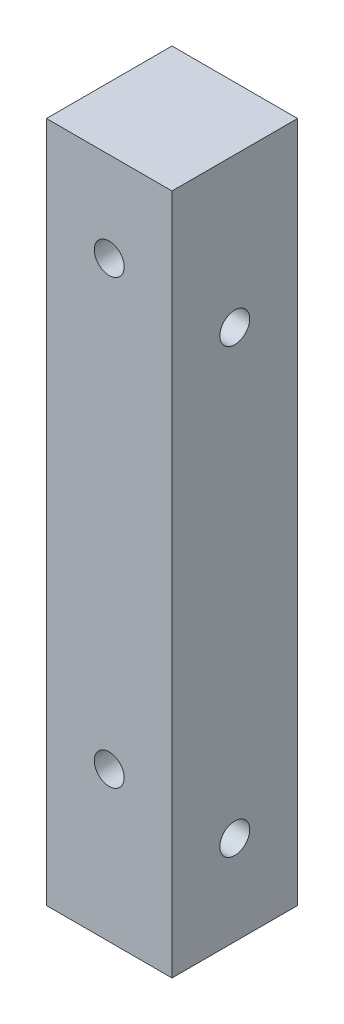
ISO-10303-21;
HEADER;
FILE_DESCRIPTION(('STEP AP214'),'2;1');
FILE_NAME('part.step','',(''),(''),'','','');
FILE_SCHEMA(('AUTOMOTIVE_DESIGN { 1 0 10303 214 1 1 1 1 }'));
ENDSEC;
DATA;
#1=APPLICATION_CONTEXT('core data for automotive mechanical design processes');
#2=APPLICATION_PROTOCOL_DEFINITION('international standard','automotive_design',2000,#1);
#3=PRODUCT_CONTEXT('',#1,'mechanical');
#4=PRODUCT('Part','Part','',(#3));
#5=PRODUCT_RELATED_PRODUCT_CATEGORY('part','',(#4));
#6=PRODUCT_DEFINITION_FORMATION('','',#4);
#7=PRODUCT_DEFINITION_CONTEXT('part definition',#1,'design');
#8=PRODUCT_DEFINITION('design','',#6,#7);
#9=PRODUCT_DEFINITION_SHAPE('','',#8);
#10=(LENGTH_UNIT() NAMED_UNIT(*) SI_UNIT(.MILLI.,.METRE.));
#11=(NAMED_UNIT(*) PLANE_ANGLE_UNIT() SI_UNIT($,.RADIAN.));
#12=(NAMED_UNIT(*) SI_UNIT($,.STERADIAN.) SOLID_ANGLE_UNIT());
#13=UNCERTAINTY_MEASURE_WITH_UNIT(LENGTH_MEASURE(1.E-05),#10,'distance_accuracy_value','');
#14=(GEOMETRIC_REPRESENTATION_CONTEXT(3) GLOBAL_UNCERTAINTY_ASSIGNED_CONTEXT((#13)) GLOBAL_UNIT_ASSIGNED_CONTEXT((#10,
#11,#12)) REPRESENTATION_CONTEXT('',''));
#15=CARTESIAN_POINT('',(0.,0.,0.));
#16=DIRECTION('',(0.,0.,1.));
#17=DIRECTION('',(1.,0.,0.));
#18=AXIS2_PLACEMENT_3D('',#15,#16,#17);
#19=CARTESIAN_POINT('',(10.5,114.,10.5));
#20=DIRECTION('',(-1.,0.,0.));
#21=DIRECTION('',(0.,0.,1.));
#22=AXIS2_PLACEMENT_3D('',#19,#20,#21);
#23=PLANE('',#22);
#24=CARTESIAN_POINT('',(10.5,89.,0.));
#25=DIRECTION('',(1.,0.,0.));
#26=DIRECTION('',(0.,0.,-1.));
#27=AXIS2_PLACEMENT_3D('',#24,#25,#26);
#28=CIRCLE('',#27,2.5);
#29=CARTESIAN_POINT('',(10.5,89.,-2.5));
#30=VERTEX_POINT('',#29);
#31=EDGE_CURVE('E151',#30,#30,#28,.T.);
#32=ORIENTED_EDGE('',*,*,#31,.F.);
#33=EDGE_LOOP('',(#32));
#34=FACE_BOUND('',#33,.T.);
#35=CARTESIAN_POINT('',(10.5,15.,0.));
#36=DIRECTION('',(1.,0.,0.));
#37=DIRECTION('',(0.,0.,-1.));
#38=AXIS2_PLACEMENT_3D('',#35,#36,#37);
#39=CIRCLE('',#38,2.5);
#40=CARTESIAN_POINT('',(10.5,15.,-2.5));
#41=VERTEX_POINT('',#40);
#42=EDGE_CURVE('E143',#41,#41,#39,.T.);
#43=ORIENTED_EDGE('',*,*,#42,.F.);
#44=EDGE_LOOP('',(#43));
#45=FACE_BOUND('',#44,.T.);
#46=DIRECTION('',(0.,0.,-1.));
#47=VECTOR('',#46,1.);
#48=CARTESIAN_POINT('',(10.5,0.,10.5));
#49=LINE('',#48,#47);
#50=CARTESIAN_POINT('',(10.5,0.,10.5));
#51=VERTEX_POINT('',#50);
#52=CARTESIAN_POINT('',(10.5,0.,-10.5));
#53=VERTEX_POINT('',#52);
#54=EDGE_CURVE('E108',#51,#53,#49,.T.);
#55=ORIENTED_EDGE('',*,*,#54,.T.);
#56=DIRECTION('',(0.,-1.,0.));
#57=VECTOR('',#56,1.);
#58=CARTESIAN_POINT('',(10.5,114.,-10.5));
#59=LINE('',#58,#57);
#60=CARTESIAN_POINT('',(10.5,114.,-10.5));
#61=VERTEX_POINT('',#60);
#62=EDGE_CURVE('E11',#61,#53,#59,.T.);
#63=ORIENTED_EDGE('',*,*,#62,.F.);
#64=DIRECTION('',(0.,0.,-1.));
#65=VECTOR('',#64,1.);
#66=CARTESIAN_POINT('',(10.5,114.,10.5));
#67=LINE('',#66,#65);
#68=CARTESIAN_POINT('',(10.5,114.,10.5));
#69=VERTEX_POINT('',#68);
#70=EDGE_CURVE('E90',#69,#61,#67,.T.);
#71=ORIENTED_EDGE('',*,*,#70,.F.);
#72=DIRECTION('',(0.,-1.,0.));
#73=VECTOR('',#72,1.);
#74=CARTESIAN_POINT('',(10.5,114.,10.5));
#75=LINE('',#74,#73);
#76=EDGE_CURVE('E104',#69,#51,#75,.T.);
#77=ORIENTED_EDGE('',*,*,#76,.T.);
#78=EDGE_LOOP('',(#55,#63,#71,#77));
#79=FACE_BOUND('',#78,.T.);
#80=ADVANCED_FACE('F38',(#34,#45,#79),#23,.F.);
#81=CARTESIAN_POINT('',(-10.5,114.,-10.5));
#82=DIRECTION('',(0.,0.,1.));
#83=DIRECTION('',(1.,0.,0.));
#84=AXIS2_PLACEMENT_3D('',#81,#82,#83);
#85=PLANE('',#84);
#86=CARTESIAN_POINT('',(0.,99.,-10.5));
#87=DIRECTION('',(0.,0.,1.));
#88=DIRECTION('',(1.,0.,0.));
#89=AXIS2_PLACEMENT_3D('',#86,#87,#88);
#90=CIRCLE('',#89,2.5);
#91=CARTESIAN_POINT('',(2.5,99.,-10.5));
#92=VERTEX_POINT('',#91);
#93=EDGE_CURVE('E112',#92,#92,#90,.T.);
#94=ORIENTED_EDGE('',*,*,#93,.T.);
#95=EDGE_LOOP('',(#94));
#96=FACE_BOUND('',#95,.T.);
#97=CARTESIAN_POINT('',(0.,25.,-10.5));
#98=DIRECTION('',(0.,0.,1.));
#99=DIRECTION('',(1.,0.,0.));
#100=AXIS2_PLACEMENT_3D('',#97,#98,#99);
#101=CIRCLE('',#100,2.5);
#102=CARTESIAN_POINT('',(2.5,25.,-10.5));
#103=VERTEX_POINT('',#102);
#104=EDGE_CURVE('E132',#103,#103,#101,.T.);
#105=ORIENTED_EDGE('',*,*,#104,.T.);
#106=EDGE_LOOP('',(#105));
#107=FACE_BOUND('',#106,.T.);
#108=DIRECTION('',(-1.,0.,0.));
#109=VECTOR('',#108,1.);
#110=CARTESIAN_POINT('',(-10.5,0.,-10.5));
#111=LINE('',#110,#109);
#112=CARTESIAN_POINT('',(-10.5,0.,-10.5));
#113=VERTEX_POINT('',#112);
#114=EDGE_CURVE('E95',#53,#113,#111,.T.);
#115=ORIENTED_EDGE('',*,*,#114,.T.);
#116=DIRECTION('',(0.,-1.,0.));
#117=VECTOR('',#116,1.);
#118=CARTESIAN_POINT('',(-10.5,114.,-10.5));
#119=LINE('',#118,#117);
#120=CARTESIAN_POINT('',(-10.5,114.,-10.5));
#121=VERTEX_POINT('',#120);
#122=EDGE_CURVE('E47',#121,#113,#119,.T.);
#123=ORIENTED_EDGE('',*,*,#122,.F.);
#124=DIRECTION('',(-1.,0.,0.));
#125=VECTOR('',#124,1.);
#126=CARTESIAN_POINT('',(-10.5,114.,-10.5));
#127=LINE('',#126,#125);
#128=EDGE_CURVE('E85',#61,#121,#127,.T.);
#129=ORIENTED_EDGE('',*,*,#128,.F.);
#130=ORIENTED_EDGE('',*,*,#62,.T.);
#131=EDGE_LOOP('',(#115,#123,#129,#130));
#132=FACE_BOUND('',#131,.T.);
#133=ADVANCED_FACE('F94',(#96,#107,#132),#85,.F.);
#134=CARTESIAN_POINT('',(-10.5,114.,10.5));
#135=DIRECTION('',(1.,0.,0.));
#136=DIRECTION('',(0.,0.,-1.));
#137=AXIS2_PLACEMENT_3D('',#134,#135,#136);
#138=PLANE('',#137);
#139=CARTESIAN_POINT('',(-10.5,89.,0.));
#140=DIRECTION('',(1.,0.,0.));
#141=DIRECTION('',(0.,0.,-1.));
#142=AXIS2_PLACEMENT_3D('',#139,#140,#141);
#143=CIRCLE('',#142,2.5);
#144=CARTESIAN_POINT('',(-10.5,89.,-2.5));
#145=VERTEX_POINT('',#144);
#146=EDGE_CURVE('E133',#145,#145,#143,.T.);
#147=ORIENTED_EDGE('',*,*,#146,.T.);
#148=EDGE_LOOP('',(#147));
#149=FACE_BOUND('',#148,.T.);
#150=CARTESIAN_POINT('',(-10.5,15.,0.));
#151=DIRECTION('',(1.,0.,0.));
#152=DIRECTION('',(0.,0.,-1.));
#153=AXIS2_PLACEMENT_3D('',#150,#151,#152);
#154=CIRCLE('',#153,2.5);
#155=CARTESIAN_POINT('',(-10.5,15.,-2.5));
#156=VERTEX_POINT('',#155);
#157=EDGE_CURVE('E147',#156,#156,#154,.T.);
#158=ORIENTED_EDGE('',*,*,#157,.T.);
#159=EDGE_LOOP('',(#158));
#160=FACE_BOUND('',#159,.T.);
#161=DIRECTION('',(0.,0.,1.));
#162=VECTOR('',#161,1.);
#163=CARTESIAN_POINT('',(-10.5,0.,10.5));
#164=LINE('',#163,#162);
#165=CARTESIAN_POINT('',(-10.5,0.,10.5));
#166=VERTEX_POINT('',#165);
#167=EDGE_CURVE('E72',#113,#166,#164,.T.);
#168=ORIENTED_EDGE('',*,*,#167,.T.);
#169=DIRECTION('',(0.,-1.,0.));
#170=VECTOR('',#169,1.);
#171=CARTESIAN_POINT('',(-10.5,114.,10.5));
#172=LINE('',#171,#170);
#173=CARTESIAN_POINT('',(-10.5,114.,10.5));
#174=VERTEX_POINT('',#173);
#175=EDGE_CURVE('E97',#174,#166,#172,.T.);
#176=ORIENTED_EDGE('',*,*,#175,.F.);
#177=DIRECTION('',(0.,0.,1.));
#178=VECTOR('',#177,1.);
#179=CARTESIAN_POINT('',(-10.5,114.,10.5));
#180=LINE('',#179,#178);
#181=EDGE_CURVE('E88',#121,#174,#180,.T.);
#182=ORIENTED_EDGE('',*,*,#181,.F.);
#183=ORIENTED_EDGE('',*,*,#122,.T.);
#184=EDGE_LOOP('',(#168,#176,#182,#183));
#185=FACE_BOUND('',#184,.T.);
#186=ADVANCED_FACE('F98',(#149,#160,#185),#138,.F.);
#187=CARTESIAN_POINT('',(-10.5,114.,10.5));
#188=DIRECTION('',(0.,0.,-1.));
#189=DIRECTION('',(-1.,0.,0.));
#190=AXIS2_PLACEMENT_3D('',#187,#188,#189);
#191=PLANE('',#190);
#192=CARTESIAN_POINT('',(0.,99.,10.5));
#193=DIRECTION('',(0.,0.,1.));
#194=DIRECTION('',(1.,0.,0.));
#195=AXIS2_PLACEMENT_3D('',#192,#193,#194);
#196=CIRCLE('',#195,2.5);
#197=CARTESIAN_POINT('',(2.5,99.,10.5));
#198=VERTEX_POINT('',#197);
#199=EDGE_CURVE('E137',#198,#198,#196,.T.);
#200=ORIENTED_EDGE('',*,*,#199,.F.);
#201=EDGE_LOOP('',(#200));
#202=FACE_BOUND('',#201,.T.);
#203=CARTESIAN_POINT('',(0.,25.,10.5));
#204=DIRECTION('',(0.,0.,1.));
#205=DIRECTION('',(1.,0.,0.));
#206=AXIS2_PLACEMENT_3D('',#203,#204,#205);
#207=CIRCLE('',#206,2.5);
#208=CARTESIAN_POINT('',(2.5,25.,10.5));
#209=VERTEX_POINT('',#208);
#210=EDGE_CURVE('E129',#209,#209,#207,.T.);
#211=ORIENTED_EDGE('',*,*,#210,.F.);
#212=EDGE_LOOP('',(#211));
#213=FACE_BOUND('',#212,.T.);
#214=DIRECTION('',(1.,0.,0.));
#215=VECTOR('',#214,1.);
#216=CARTESIAN_POINT('',(-10.5,0.,10.5));
#217=LINE('',#216,#215);
#218=EDGE_CURVE('E78',#166,#51,#217,.T.);
#219=ORIENTED_EDGE('',*,*,#218,.T.);
#220=ORIENTED_EDGE('',*,*,#76,.F.);
#221=DIRECTION('',(1.,0.,0.));
#222=VECTOR('',#221,1.);
#223=CARTESIAN_POINT('',(-10.5,114.,10.5));
#224=LINE('',#223,#222);
#225=EDGE_CURVE('E55',#174,#69,#224,.T.);
#226=ORIENTED_EDGE('',*,*,#225,.F.);
#227=ORIENTED_EDGE('',*,*,#175,.T.);
#228=EDGE_LOOP('',(#219,#220,#226,#227));
#229=FACE_BOUND('',#228,.T.);
#230=ADVANCED_FACE('F122',(#202,#213,#229),#191,.F.);
#231=CARTESIAN_POINT('',(0.,114.,0.));
#232=DIRECTION('',(0.,-1.,0.));
#233=DIRECTION('',(0.,0.,-1.));
#234=AXIS2_PLACEMENT_3D('',#231,#232,#233);
#235=PLANE('',#234);
#236=ORIENTED_EDGE('',*,*,#70,.T.);
#237=ORIENTED_EDGE('',*,*,#128,.T.);
#238=ORIENTED_EDGE('',*,*,#181,.T.);
#239=ORIENTED_EDGE('',*,*,#225,.T.);
#240=EDGE_LOOP('',(#236,#237,#238,#239));
#241=FACE_BOUND('',#240,.T.);
#242=ADVANCED_FACE('F86',(#241),#235,.F.);
#243=CARTESIAN_POINT('',(0.,0.,0.));
#244=DIRECTION('',(0.,-1.,0.));
#245=DIRECTION('',(0.,0.,-1.));
#246=AXIS2_PLACEMENT_3D('',#243,#244,#245);
#247=PLANE('',#246);
#248=ORIENTED_EDGE('',*,*,#54,.F.);
#249=ORIENTED_EDGE('',*,*,#218,.F.);
#250=ORIENTED_EDGE('',*,*,#167,.F.);
#251=ORIENTED_EDGE('',*,*,#114,.F.);
#252=EDGE_LOOP('',(#248,#249,#250,#251));
#253=FACE_BOUND('',#252,.T.);
#254=ADVANCED_FACE('F125',(#253),#247,.T.);
#255=CARTESIAN_POINT('',(0.,25.,-10.5));
#256=DIRECTION('',(0.,0.,1.));
#257=DIRECTION('',(1.,0.,0.));
#258=AXIS2_PLACEMENT_3D('',#255,#256,#257);
#259=CYLINDRICAL_SURFACE('',#258,2.5);
#260=CARTESIAN_POINT('',(2.5,25.,-10.5));
#261=CARTESIAN_POINT('',(2.5,25.,-10.28125));
#262=CARTESIAN_POINT('',(2.5,25.,-10.0625));
#263=CARTESIAN_POINT('',(2.5,25.,-9.625));
#264=CARTESIAN_POINT('',(2.5,25.,-9.40625));
#265=CARTESIAN_POINT('',(2.5,25.,-8.96875));
#266=CARTESIAN_POINT('',(2.5,25.,-8.75));
#267=CARTESIAN_POINT('',(2.5,25.,-8.3125));
#268=CARTESIAN_POINT('',(2.5,25.,-8.09375));
#269=CARTESIAN_POINT('',(2.5,25.,-7.65625));
#270=CARTESIAN_POINT('',(2.5,25.,-7.4375));
#271=CARTESIAN_POINT('',(2.5,25.,-7.));
#272=CARTESIAN_POINT('',(2.5,25.,-6.78125));
#273=CARTESIAN_POINT('',(2.5,25.,-6.34375));
#274=CARTESIAN_POINT('',(2.5,25.,-6.125));
#275=CARTESIAN_POINT('',(2.5,25.,-5.6875));
#276=CARTESIAN_POINT('',(2.5,25.,-5.46875));
#277=CARTESIAN_POINT('',(2.5,25.,-5.03125));
#278=CARTESIAN_POINT('',(2.5,25.,-4.8125));
#279=CARTESIAN_POINT('',(2.5,25.,-4.375));
#280=CARTESIAN_POINT('',(2.5,25.,-4.15625));
#281=CARTESIAN_POINT('',(2.5,25.,-3.71875));
#282=CARTESIAN_POINT('',(2.5,25.,-3.5));
#283=CARTESIAN_POINT('',(2.5,25.,-3.0625));
#284=CARTESIAN_POINT('',(2.5,25.,-2.84375));
#285=CARTESIAN_POINT('',(2.5,25.,-2.40625));
#286=CARTESIAN_POINT('',(2.5,25.,-2.1875));
#287=CARTESIAN_POINT('',(2.5,25.,-1.75));
#288=CARTESIAN_POINT('',(2.5,25.,-1.53125));
#289=CARTESIAN_POINT('',(2.5,25.,-1.09375));
#290=CARTESIAN_POINT('',(2.5,25.,-0.875000000000001));
#291=CARTESIAN_POINT('',(2.5,25.,-0.4375));
#292=CARTESIAN_POINT('',(2.5,25.,-0.21875));
#293=CARTESIAN_POINT('',(2.5,25.,0.21875));
#294=CARTESIAN_POINT('',(2.5,25.,0.4375));
#295=CARTESIAN_POINT('',(2.5,25.,0.875000000000001));
#296=CARTESIAN_POINT('',(2.5,25.,1.09375));
#297=CARTESIAN_POINT('',(2.5,25.,1.53125));
#298=CARTESIAN_POINT('',(2.5,25.,1.75));
#299=CARTESIAN_POINT('',(2.5,25.,2.1875));
#300=CARTESIAN_POINT('',(2.5,25.,2.40625));
#301=CARTESIAN_POINT('',(2.5,25.,2.84375));
#302=CARTESIAN_POINT('',(2.5,25.,3.0625));
#303=CARTESIAN_POINT('',(2.5,25.,3.5));
#304=CARTESIAN_POINT('',(2.5,25.,3.71875));
#305=CARTESIAN_POINT('',(2.5,25.,4.15625));
#306=CARTESIAN_POINT('',(2.5,25.,4.375));
#307=CARTESIAN_POINT('',(2.5,25.,4.8125));
#308=CARTESIAN_POINT('',(2.5,25.,5.03125));
#309=CARTESIAN_POINT('',(2.5,25.,5.46875));
#310=CARTESIAN_POINT('',(2.5,25.,5.6875));
#311=CARTESIAN_POINT('',(2.5,25.,6.125));
#312=CARTESIAN_POINT('',(2.5,25.,6.34375));
#313=CARTESIAN_POINT('',(2.5,25.,6.78125));
#314=CARTESIAN_POINT('',(2.5,25.,7.));
#315=CARTESIAN_POINT('',(2.5,25.,7.4375));
#316=CARTESIAN_POINT('',(2.5,25.,7.65625));
#317=CARTESIAN_POINT('',(2.5,25.,8.09375));
#318=CARTESIAN_POINT('',(2.5,25.,8.3125));
#319=CARTESIAN_POINT('',(2.5,25.,8.75));
#320=CARTESIAN_POINT('',(2.5,25.,8.96875));
#321=CARTESIAN_POINT('',(2.5,25.,9.40625));
#322=CARTESIAN_POINT('',(2.5,25.,9.625));
#323=CARTESIAN_POINT('',(2.5,25.,10.0625));
#324=CARTESIAN_POINT('',(2.5,25.,10.28125));
#325=CARTESIAN_POINT('',(2.5,25.,10.5));
#326=B_SPLINE_CURVE_WITH_KNOTS('',3,(#260,#261,#262,#263,#264,#265,#266,#267,#268,#269,#270,
#271,#272,#273,#274,#275,#276,#277,#278,#279,#280,#281,#282,#283,#284,#285,#286,#287,#288,#289,
#290,#291,#292,#293,#294,#295,#296,#297,#298,#299,#300,#301,#302,#303,#304,#305,#306,#307,#308,
#309,#310,#311,#312,#313,#314,#315,#316,#317,#318,#319,#320,#321,#322,#323,#324,#325),
.UNSPECIFIED.,.F.,.F.,(4,2,2,2,2,2,2,2,2,2,2,2,2,2,2,2,2,2,2,2,2,2,2,2,2,2,2,2,2,2,2,2,4),(0.,
0.656249999999999,1.3125,1.96875,2.625,3.28125,3.9375,4.59375,5.25,5.90625,6.5625,7.21875,7.875,
8.53125,9.1875,9.84375,10.5,11.15625,11.8125,12.46875,13.125,13.78125,14.4375,15.09375,15.75,
16.40625,17.0625,17.71875,18.375,19.03125,19.6875,20.34375,21.),.UNSPECIFIED.);
#327=EDGE_CURVE('BSEAM179',#103,#209,#326,.T.);
#328=ORIENTED_EDGE('',*,*,#104,.F.);
#329=ORIENTED_EDGE('',*,*,#210,.T.);
#330=ORIENTED_EDGE('',*,*,#327,.T.);
#331=ORIENTED_EDGE('',*,*,#327,.F.);
#332=EDGE_LOOP('',(#328,#330,#329,#331));
#333=FACE_BOUND('',#332,.T.);
#334=ADVANCED_FACE('F179',(#333),#259,.F.);
#335=CARTESIAN_POINT('',(0.,99.,-10.5));
#336=DIRECTION('',(0.,0.,1.));
#337=DIRECTION('',(1.,0.,0.));
#338=AXIS2_PLACEMENT_3D('',#335,#336,#337);
#339=CYLINDRICAL_SURFACE('',#338,2.5);
#340=CARTESIAN_POINT('',(2.5,99.,-10.5));
#341=CARTESIAN_POINT('',(2.5,99.,-10.28125));
#342=CARTESIAN_POINT('',(2.5,99.,-10.0625));
#343=CARTESIAN_POINT('',(2.5,99.,-9.625));
#344=CARTESIAN_POINT('',(2.5,99.,-9.40625));
#345=CARTESIAN_POINT('',(2.5,99.,-8.96875));
#346=CARTESIAN_POINT('',(2.5,99.,-8.75));
#347=CARTESIAN_POINT('',(2.5,99.,-8.3125));
#348=CARTESIAN_POINT('',(2.5,99.,-8.09375));
#349=CARTESIAN_POINT('',(2.5,99.,-7.65625));
#350=CARTESIAN_POINT('',(2.5,99.,-7.4375));
#351=CARTESIAN_POINT('',(2.5,99.,-7.));
#352=CARTESIAN_POINT('',(2.5,99.,-6.78125));
#353=CARTESIAN_POINT('',(2.5,99.,-6.34375));
#354=CARTESIAN_POINT('',(2.5,99.,-6.125));
#355=CARTESIAN_POINT('',(2.5,99.,-5.6875));
#356=CARTESIAN_POINT('',(2.5,99.,-5.46875));
#357=CARTESIAN_POINT('',(2.5,99.,-5.03125));
#358=CARTESIAN_POINT('',(2.5,99.,-4.8125));
#359=CARTESIAN_POINT('',(2.5,99.,-4.375));
#360=CARTESIAN_POINT('',(2.5,99.,-4.15625));
#361=CARTESIAN_POINT('',(2.5,99.,-3.71875));
#362=CARTESIAN_POINT('',(2.5,99.,-3.5));
#363=CARTESIAN_POINT('',(2.5,99.,-3.0625));
#364=CARTESIAN_POINT('',(2.5,99.,-2.84375));
#365=CARTESIAN_POINT('',(2.5,99.,-2.40625));
#366=CARTESIAN_POINT('',(2.5,99.,-2.1875));
#367=CARTESIAN_POINT('',(2.5,99.,-1.75));
#368=CARTESIAN_POINT('',(2.5,99.,-1.53125));
#369=CARTESIAN_POINT('',(2.5,99.,-1.09375));
#370=CARTESIAN_POINT('',(2.5,99.,-0.875000000000001));
#371=CARTESIAN_POINT('',(2.5,99.,-0.4375));
#372=CARTESIAN_POINT('',(2.5,99.,-0.21875));
#373=CARTESIAN_POINT('',(2.5,99.,0.21875));
#374=CARTESIAN_POINT('',(2.5,99.,0.4375));
#375=CARTESIAN_POINT('',(2.5,99.,0.875000000000001));
#376=CARTESIAN_POINT('',(2.5,99.,1.09375));
#377=CARTESIAN_POINT('',(2.5,99.,1.53125));
#378=CARTESIAN_POINT('',(2.5,99.,1.75));
#379=CARTESIAN_POINT('',(2.5,99.,2.1875));
#380=CARTESIAN_POINT('',(2.5,99.,2.40625));
#381=CARTESIAN_POINT('',(2.5,99.,2.84375));
#382=CARTESIAN_POINT('',(2.5,99.,3.0625));
#383=CARTESIAN_POINT('',(2.5,99.,3.5));
#384=CARTESIAN_POINT('',(2.5,99.,3.71875));
#385=CARTESIAN_POINT('',(2.5,99.,4.15625));
#386=CARTESIAN_POINT('',(2.5,99.,4.375));
#387=CARTESIAN_POINT('',(2.5,99.,4.8125));
#388=CARTESIAN_POINT('',(2.5,99.,5.03125));
#389=CARTESIAN_POINT('',(2.5,99.,5.46875));
#390=CARTESIAN_POINT('',(2.5,99.,5.6875));
#391=CARTESIAN_POINT('',(2.5,99.,6.125));
#392=CARTESIAN_POINT('',(2.5,99.,6.34375));
#393=CARTESIAN_POINT('',(2.5,99.,6.78125));
#394=CARTESIAN_POINT('',(2.5,99.,7.));
#395=CARTESIAN_POINT('',(2.5,99.,7.4375));
#396=CARTESIAN_POINT('',(2.5,99.,7.65625));
#397=CARTESIAN_POINT('',(2.5,99.,8.09375));
#398=CARTESIAN_POINT('',(2.5,99.,8.3125));
#399=CARTESIAN_POINT('',(2.5,99.,8.75));
#400=CARTESIAN_POINT('',(2.5,99.,8.96875));
#401=CARTESIAN_POINT('',(2.5,99.,9.40625));
#402=CARTESIAN_POINT('',(2.5,99.,9.625));
#403=CARTESIAN_POINT('',(2.5,99.,10.0625));
#404=CARTESIAN_POINT('',(2.5,99.,10.28125));
#405=CARTESIAN_POINT('',(2.5,99.,10.5));
#406=B_SPLINE_CURVE_WITH_KNOTS('',3,(#340,#341,#342,#343,#344,#345,#346,#347,#348,#349,#350,
#351,#352,#353,#354,#355,#356,#357,#358,#359,#360,#361,#362,#363,#364,#365,#366,#367,#368,#369,
#370,#371,#372,#373,#374,#375,#376,#377,#378,#379,#380,#381,#382,#383,#384,#385,#386,#387,#388,
#389,#390,#391,#392,#393,#394,#395,#396,#397,#398,#399,#400,#401,#402,#403,#404,#405),
.UNSPECIFIED.,.F.,.F.,(4,2,2,2,2,2,2,2,2,2,2,2,2,2,2,2,2,2,2,2,2,2,2,2,2,2,2,2,2,2,2,2,4),(0.,
0.656249999999999,1.3125,1.96875,2.625,3.28125,3.9375,4.59375,5.25,5.90625,6.5625,7.21875,7.875,
8.53125,9.1875,9.84375,10.5,11.15625,11.8125,12.46875,13.125,13.78125,14.4375,15.09375,15.75,
16.40625,17.0625,17.71875,18.375,19.03125,19.6875,20.34375,21.),.UNSPECIFIED.);
#407=EDGE_CURVE('BSEAM173',#92,#198,#406,.T.);
#408=ORIENTED_EDGE('',*,*,#93,.F.);
#409=ORIENTED_EDGE('',*,*,#199,.T.);
#410=ORIENTED_EDGE('',*,*,#407,.T.);
#411=ORIENTED_EDGE('',*,*,#407,.F.);
#412=EDGE_LOOP('',(#408,#410,#409,#411));
#413=FACE_BOUND('',#412,.T.);
#414=ADVANCED_FACE('F173',(#413),#339,.F.);
#415=CARTESIAN_POINT('',(-10.5,15.,0.));
#416=DIRECTION('',(1.,0.,0.));
#417=DIRECTION('',(0.,0.,-1.));
#418=AXIS2_PLACEMENT_3D('',#415,#416,#417);
#419=CYLINDRICAL_SURFACE('',#418,2.5);
#420=CARTESIAN_POINT('',(-10.5,15.,-2.5));
#421=CARTESIAN_POINT('',(-10.28125,15.,-2.5));
#422=CARTESIAN_POINT('',(-10.0625,15.,-2.5));
#423=CARTESIAN_POINT('',(-9.625,15.,-2.5));
#424=CARTESIAN_POINT('',(-9.40625,15.,-2.5));
#425=CARTESIAN_POINT('',(-8.96875,15.,-2.5));
#426=CARTESIAN_POINT('',(-8.75,15.,-2.5));
#427=CARTESIAN_POINT('',(-8.3125,15.,-2.5));
#428=CARTESIAN_POINT('',(-8.09375,15.,-2.5));
#429=CARTESIAN_POINT('',(-7.65625,15.,-2.5));
#430=CARTESIAN_POINT('',(-7.4375,15.,-2.5));
#431=CARTESIAN_POINT('',(-7.,15.,-2.5));
#432=CARTESIAN_POINT('',(-6.78125,15.,-2.5));
#433=CARTESIAN_POINT('',(-6.34375,15.,-2.5));
#434=CARTESIAN_POINT('',(-6.125,15.,-2.5));
#435=CARTESIAN_POINT('',(-5.6875,15.,-2.5));
#436=CARTESIAN_POINT('',(-5.46875,15.,-2.5));
#437=CARTESIAN_POINT('',(-5.03125,15.,-2.5));
#438=CARTESIAN_POINT('',(-4.8125,15.,-2.5));
#439=CARTESIAN_POINT('',(-4.375,15.,-2.5));
#440=CARTESIAN_POINT('',(-4.15625,15.,-2.5));
#441=CARTESIAN_POINT('',(-3.71875,15.,-2.5));
#442=CARTESIAN_POINT('',(-3.5,15.,-2.5));
#443=CARTESIAN_POINT('',(-3.0625,15.,-2.5));
#444=CARTESIAN_POINT('',(-2.84375,15.,-2.5));
#445=CARTESIAN_POINT('',(-2.40625,15.,-2.5));
#446=CARTESIAN_POINT('',(-2.1875,15.,-2.5));
#447=CARTESIAN_POINT('',(-1.75,15.,-2.5));
#448=CARTESIAN_POINT('',(-1.53125,15.,-2.5));
#449=CARTESIAN_POINT('',(-1.09375,15.,-2.5));
#450=CARTESIAN_POINT('',(-0.875000000000003,15.,-2.5));
#451=CARTESIAN_POINT('',(-0.437500000000002,15.,-2.5));
#452=CARTESIAN_POINT('',(-0.218750000000002,15.,-2.5));
#453=CARTESIAN_POINT('',(0.218749999999998,15.,-2.5));
#454=CARTESIAN_POINT('',(0.437499999999999,15.,-2.5));
#455=CARTESIAN_POINT('',(0.874999999999999,15.,-2.5));
#456=CARTESIAN_POINT('',(1.09375,15.,-2.5));
#457=CARTESIAN_POINT('',(1.53125,15.,-2.5));
#458=CARTESIAN_POINT('',(1.75,15.,-2.5));
#459=CARTESIAN_POINT('',(2.1875,15.,-2.5));
#460=CARTESIAN_POINT('',(2.40625,15.,-2.5));
#461=CARTESIAN_POINT('',(2.84375,15.,-2.5));
#462=CARTESIAN_POINT('',(3.0625,15.,-2.5));
#463=CARTESIAN_POINT('',(3.5,15.,-2.5));
#464=CARTESIAN_POINT('',(3.71875,15.,-2.5));
#465=CARTESIAN_POINT('',(4.15625,15.,-2.5));
#466=CARTESIAN_POINT('',(4.375,15.,-2.5));
#467=CARTESIAN_POINT('',(4.8125,15.,-2.5));
#468=CARTESIAN_POINT('',(5.03125,15.,-2.5));
#469=CARTESIAN_POINT('',(5.46875,15.,-2.5));
#470=CARTESIAN_POINT('',(5.6875,15.,-2.5));
#471=CARTESIAN_POINT('',(6.125,15.,-2.5));
#472=CARTESIAN_POINT('',(6.34375,15.,-2.5));
#473=CARTESIAN_POINT('',(6.78125,15.,-2.5));
#474=CARTESIAN_POINT('',(7.,15.,-2.5));
#475=CARTESIAN_POINT('',(7.4375,15.,-2.5));
#476=CARTESIAN_POINT('',(7.65625,15.,-2.5));
#477=CARTESIAN_POINT('',(8.09375,15.,-2.5));
#478=CARTESIAN_POINT('',(8.3125,15.,-2.5));
#479=CARTESIAN_POINT('',(8.75,15.,-2.5));
#480=CARTESIAN_POINT('',(8.96875,15.,-2.5));
#481=CARTESIAN_POINT('',(9.40625,15.,-2.5));
#482=CARTESIAN_POINT('',(9.625,15.,-2.5));
#483=CARTESIAN_POINT('',(10.0625,15.,-2.5));
#484=CARTESIAN_POINT('',(10.28125,15.,-2.5));
#485=CARTESIAN_POINT('',(10.5,15.,-2.5));
#486=B_SPLINE_CURVE_WITH_KNOTS('',3,(#420,#421,#422,#423,#424,#425,#426,#427,#428,#429,#430,
#431,#432,#433,#434,#435,#436,#437,#438,#439,#440,#441,#442,#443,#444,#445,#446,#447,#448,#449,
#450,#451,#452,#453,#454,#455,#456,#457,#458,#459,#460,#461,#462,#463,#464,#465,#466,#467,#468,
#469,#470,#471,#472,#473,#474,#475,#476,#477,#478,#479,#480,#481,#482,#483,#484,#485),
.UNSPECIFIED.,.F.,.F.,(4,2,2,2,2,2,2,2,2,2,2,2,2,2,2,2,2,2,2,2,2,2,2,2,2,2,2,2,2,2,2,2,4),(0.,
0.656249999999999,1.3125,1.96875,2.625,3.28125,3.9375,4.59375,5.25,5.90625,6.5625,7.21875,7.875,
8.53125,9.1875,9.84375,10.5,11.15625,11.8125,12.46875,13.125,13.78125,14.4375,15.09375,15.75,
16.40625,17.0625,17.71875,18.375,19.03125,19.6875,20.34375,21.),.UNSPECIFIED.);
#487=EDGE_CURVE('BSEAM164',#156,#41,#486,.T.);
#488=ORIENTED_EDGE('',*,*,#157,.F.);
#489=ORIENTED_EDGE('',*,*,#42,.T.);
#490=ORIENTED_EDGE('',*,*,#487,.T.);
#491=ORIENTED_EDGE('',*,*,#487,.F.);
#492=EDGE_LOOP('',(#488,#490,#489,#491));
#493=FACE_BOUND('',#492,.T.);
#494=ADVANCED_FACE('F164',(#493),#419,.F.);
#495=CARTESIAN_POINT('',(-10.5,89.,0.));
#496=DIRECTION('',(1.,0.,0.));
#497=DIRECTION('',(0.,0.,-1.));
#498=AXIS2_PLACEMENT_3D('',#495,#496,#497);
#499=CYLINDRICAL_SURFACE('',#498,2.5);
#500=CARTESIAN_POINT('',(-10.5,89.,-2.5));
#501=CARTESIAN_POINT('',(-10.28125,89.,-2.5));
#502=CARTESIAN_POINT('',(-10.0625,89.,-2.5));
#503=CARTESIAN_POINT('',(-9.625,89.,-2.5));
#504=CARTESIAN_POINT('',(-9.40625,89.,-2.5));
#505=CARTESIAN_POINT('',(-8.96875,89.,-2.5));
#506=CARTESIAN_POINT('',(-8.75,89.,-2.5));
#507=CARTESIAN_POINT('',(-8.3125,89.,-2.5));
#508=CARTESIAN_POINT('',(-8.09375,89.,-2.5));
#509=CARTESIAN_POINT('',(-7.65625,89.,-2.5));
#510=CARTESIAN_POINT('',(-7.4375,89.,-2.5));
#511=CARTESIAN_POINT('',(-7.,89.,-2.5));
#512=CARTESIAN_POINT('',(-6.78125,89.,-2.5));
#513=CARTESIAN_POINT('',(-6.34375,89.,-2.5));
#514=CARTESIAN_POINT('',(-6.125,89.,-2.5));
#515=CARTESIAN_POINT('',(-5.6875,89.,-2.5));
#516=CARTESIAN_POINT('',(-5.46875,89.,-2.5));
#517=CARTESIAN_POINT('',(-5.03125,89.,-2.5));
#518=CARTESIAN_POINT('',(-4.8125,89.,-2.5));
#519=CARTESIAN_POINT('',(-4.375,89.,-2.5));
#520=CARTESIAN_POINT('',(-4.15625,89.,-2.5));
#521=CARTESIAN_POINT('',(-3.71875,89.,-2.5));
#522=CARTESIAN_POINT('',(-3.5,89.,-2.5));
#523=CARTESIAN_POINT('',(-3.0625,89.,-2.5));
#524=CARTESIAN_POINT('',(-2.84375,89.,-2.5));
#525=CARTESIAN_POINT('',(-2.40625,89.,-2.5));
#526=CARTESIAN_POINT('',(-2.1875,89.,-2.5));
#527=CARTESIAN_POINT('',(-1.75,89.,-2.5));
#528=CARTESIAN_POINT('',(-1.53125,89.,-2.5));
#529=CARTESIAN_POINT('',(-1.09375,89.,-2.5));
#530=CARTESIAN_POINT('',(-0.875000000000003,89.,-2.5));
#531=CARTESIAN_POINT('',(-0.437500000000002,89.,-2.5));
#532=CARTESIAN_POINT('',(-0.218750000000002,89.,-2.5));
#533=CARTESIAN_POINT('',(0.218749999999998,89.,-2.5));
#534=CARTESIAN_POINT('',(0.437499999999999,89.,-2.5));
#535=CARTESIAN_POINT('',(0.874999999999999,89.,-2.5));
#536=CARTESIAN_POINT('',(1.09375,89.,-2.5));
#537=CARTESIAN_POINT('',(1.53125,89.,-2.5));
#538=CARTESIAN_POINT('',(1.75,89.,-2.5));
#539=CARTESIAN_POINT('',(2.1875,89.,-2.5));
#540=CARTESIAN_POINT('',(2.40625,89.,-2.5));
#541=CARTESIAN_POINT('',(2.84375,89.,-2.5));
#542=CARTESIAN_POINT('',(3.0625,89.,-2.5));
#543=CARTESIAN_POINT('',(3.5,89.,-2.5));
#544=CARTESIAN_POINT('',(3.71875,89.,-2.5));
#545=CARTESIAN_POINT('',(4.15625,89.,-2.5));
#546=CARTESIAN_POINT('',(4.375,89.,-2.5));
#547=CARTESIAN_POINT('',(4.8125,89.,-2.5));
#548=CARTESIAN_POINT('',(5.03125,89.,-2.5));
#549=CARTESIAN_POINT('',(5.46875,89.,-2.5));
#550=CARTESIAN_POINT('',(5.6875,89.,-2.5));
#551=CARTESIAN_POINT('',(6.125,89.,-2.5));
#552=CARTESIAN_POINT('',(6.34375,89.,-2.5));
#553=CARTESIAN_POINT('',(6.78125,89.,-2.5));
#554=CARTESIAN_POINT('',(7.,89.,-2.5));
#555=CARTESIAN_POINT('',(7.4375,89.,-2.5));
#556=CARTESIAN_POINT('',(7.65625,89.,-2.5));
#557=CARTESIAN_POINT('',(8.09375,89.,-2.5));
#558=CARTESIAN_POINT('',(8.3125,89.,-2.5));
#559=CARTESIAN_POINT('',(8.75,89.,-2.5));
#560=CARTESIAN_POINT('',(8.96875,89.,-2.5));
#561=CARTESIAN_POINT('',(9.40625,89.,-2.5));
#562=CARTESIAN_POINT('',(9.625,89.,-2.5));
#563=CARTESIAN_POINT('',(10.0625,89.,-2.5));
#564=CARTESIAN_POINT('',(10.28125,89.,-2.5));
#565=CARTESIAN_POINT('',(10.5,89.,-2.5));
#566=B_SPLINE_CURVE_WITH_KNOTS('',3,(#500,#501,#502,#503,#504,#505,#506,#507,#508,#509,#510,
#511,#512,#513,#514,#515,#516,#517,#518,#519,#520,#521,#522,#523,#524,#525,#526,#527,#528,#529,
#530,#531,#532,#533,#534,#535,#536,#537,#538,#539,#540,#541,#542,#543,#544,#545,#546,#547,#548,
#549,#550,#551,#552,#553,#554,#555,#556,#557,#558,#559,#560,#561,#562,#563,#564,#565),
.UNSPECIFIED.,.F.,.F.,(4,2,2,2,2,2,2,2,2,2,2,2,2,2,2,2,2,2,2,2,2,2,2,2,2,2,2,2,2,2,2,2,4),(0.,
0.656249999999999,1.3125,1.96875,2.625,3.28125,3.9375,4.59375,5.25,5.90625,6.5625,7.21875,7.875,
8.53125,9.1875,9.84375,10.5,11.15625,11.8125,12.46875,13.125,13.78125,14.4375,15.09375,15.75,
16.40625,17.0625,17.71875,18.375,19.03125,19.6875,20.34375,21.),.UNSPECIFIED.);
#567=EDGE_CURVE('BSEAM161',#145,#30,#566,.T.);
#568=ORIENTED_EDGE('',*,*,#146,.F.);
#569=ORIENTED_EDGE('',*,*,#31,.T.);
#570=ORIENTED_EDGE('',*,*,#567,.T.);
#571=ORIENTED_EDGE('',*,*,#567,.F.);
#572=EDGE_LOOP('',(#568,#570,#569,#571));
#573=FACE_BOUND('',#572,.T.);
#574=ADVANCED_FACE('F161',(#573),#499,.F.);
#575=CLOSED_SHELL('',(#80,#133,#186,#230,#242,#254,#334,#414,#494,#574));
#576=MANIFOLD_SOLID_BREP('B2',#575);
#577=ADVANCED_BREP_SHAPE_REPRESENTATION('',(#18,#576),#14);
#578=SHAPE_DEFINITION_REPRESENTATION(#9,#577);
ENDSEC;
END-ISO-10303-21;
